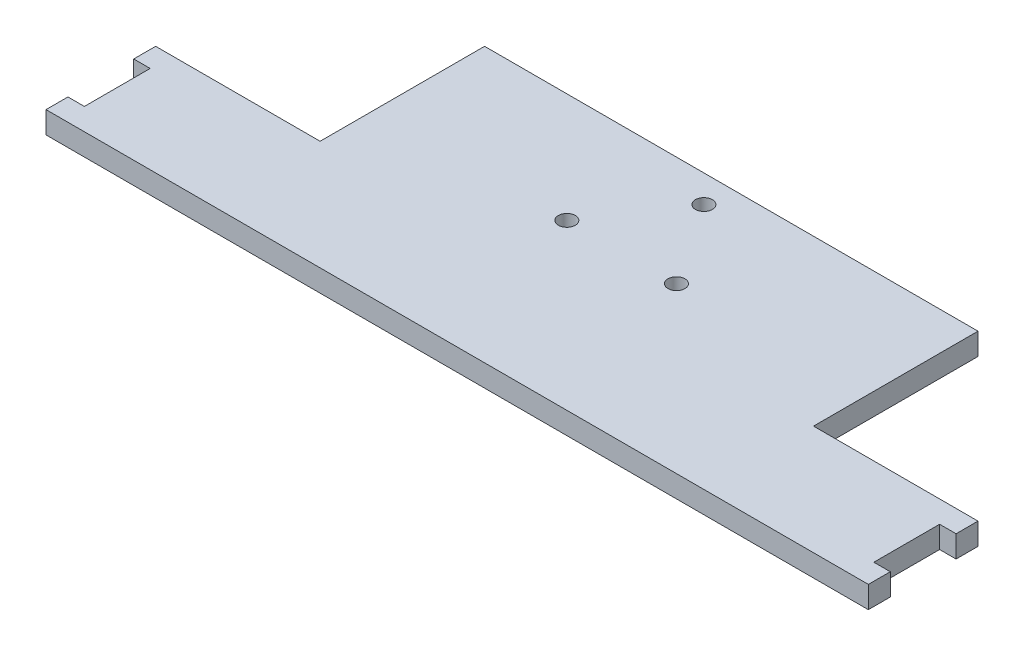
ISO-10303-21;
HEADER;
FILE_DESCRIPTION(('STEP AP214'),'2;1');
FILE_NAME('part.step','',(''),(''),'','','');
FILE_SCHEMA(('AUTOMOTIVE_DESIGN { 1 0 10303 214 1 1 1 1 }'));
ENDSEC;
DATA;
#1=APPLICATION_CONTEXT('core data for automotive mechanical design processes');
#2=APPLICATION_PROTOCOL_DEFINITION('international standard','automotive_design',2000,#1);
#3=PRODUCT_CONTEXT('',#1,'mechanical');
#4=PRODUCT('Part','Part','',(#3));
#5=PRODUCT_RELATED_PRODUCT_CATEGORY('part','',(#4));
#6=PRODUCT_DEFINITION_FORMATION('','',#4);
#7=PRODUCT_DEFINITION_CONTEXT('part definition',#1,'design');
#8=PRODUCT_DEFINITION('design','',#6,#7);
#9=PRODUCT_DEFINITION_SHAPE('','',#8);
#10=(LENGTH_UNIT() NAMED_UNIT(*) SI_UNIT(.MILLI.,.METRE.));
#11=(NAMED_UNIT(*) PLANE_ANGLE_UNIT() SI_UNIT($,.RADIAN.));
#12=(NAMED_UNIT(*) SI_UNIT($,.STERADIAN.) SOLID_ANGLE_UNIT());
#13=UNCERTAINTY_MEASURE_WITH_UNIT(LENGTH_MEASURE(1.E-05),#10,'distance_accuracy_value','');
#14=(GEOMETRIC_REPRESENTATION_CONTEXT(3) GLOBAL_UNCERTAINTY_ASSIGNED_CONTEXT((#13)) GLOBAL_UNIT_ASSIGNED_CONTEXT((#10,
#11,#12)) REPRESENTATION_CONTEXT('',''));
#15=CARTESIAN_POINT('',(0.,0.,0.));
#16=DIRECTION('',(0.,0.,1.));
#17=DIRECTION('',(1.,0.,0.));
#18=AXIS2_PLACEMENT_3D('',#15,#16,#17);
#19=CARTESIAN_POINT('',(0.,4.,0.));
#20=DIRECTION('',(0.,-1.,0.));
#21=DIRECTION('',(0.,0.,-1.));
#22=AXIS2_PLACEMENT_3D('',#19,#20,#21);
#23=PLANE('',#22);
#24=CARTESIAN_POINT('',(125.000000000001,4.,-245.));
#25=DIRECTION('',(0.,1.,0.));
#26=DIRECTION('',(0.,0.,1.));
#27=AXIS2_PLACEMENT_3D('',#24,#25,#26);
#28=CIRCLE('',#27,1.54999999999997);
#29=CARTESIAN_POINT('',(125.000000000001,4.,-243.45));
#30=VERTEX_POINT('',#29);
#31=EDGE_CURVE('E313',#30,#30,#28,.T.);
#32=ORIENTED_EDGE('',*,*,#31,.F.);
#33=EDGE_LOOP('',(#32));
#34=FACE_BOUND('',#33,.T.);
#35=CARTESIAN_POINT('',(115.000000000001,4.,-230.));
#36=DIRECTION('',(0.,1.,0.));
#37=DIRECTION('',(0.,0.,1.));
#38=AXIS2_PLACEMENT_3D('',#35,#36,#37);
#39=CIRCLE('',#38,1.54999999999999);
#40=CARTESIAN_POINT('',(115.000000000001,4.,-228.45));
#41=VERTEX_POINT('',#40);
#42=EDGE_CURVE('E309',#41,#41,#39,.T.);
#43=ORIENTED_EDGE('',*,*,#42,.F.);
#44=EDGE_LOOP('',(#43));
#45=FACE_BOUND('',#44,.T.);
#46=CARTESIAN_POINT('',(135.000000000001,4.,-230.));
#47=DIRECTION('',(0.,1.,0.));
#48=DIRECTION('',(0.,0.,1.));
#49=AXIS2_PLACEMENT_3D('',#46,#47,#48);
#50=CIRCLE('',#49,1.54999999999999);
#51=CARTESIAN_POINT('',(135.000000000001,4.,-228.45));
#52=VERTEX_POINT('',#51);
#53=EDGE_CURVE('E280',#52,#52,#50,.T.);
#54=ORIENTED_EDGE('',*,*,#53,.F.);
#55=EDGE_LOOP('',(#54));
#56=FACE_BOUND('',#55,.T.);
#57=DIRECTION('',(1.,0.,0.));
#58=VECTOR('',#57,1.);
#59=CARTESIAN_POINT('',(0.,4.,-204.000000000001));
#60=LINE('',#59,#58);
#61=CARTESIAN_POINT('',(50.0000000000004,4.,-204.000000000001));
#62=VERTEX_POINT('',#61);
#63=CARTESIAN_POINT('',(53.0000000000004,4.,-204.000000000001));
#64=VERTEX_POINT('',#63);
#65=EDGE_CURVE('E245',#62,#64,#60,.T.);
#66=ORIENTED_EDGE('',*,*,#65,.F.);
#67=DIRECTION('',(0.,0.,-1.));
#68=VECTOR('',#67,1.);
#69=CARTESIAN_POINT('',(49.9999999999998,4.,1.62493085091497E-13));
#70=LINE('',#69,#68);
#71=CARTESIAN_POINT('',(50.0000000000004,4.,-200.));
#72=VERTEX_POINT('',#71);
#73=EDGE_CURVE('E253',#72,#62,#70,.T.);
#74=ORIENTED_EDGE('',*,*,#73,.F.);
#75=DIRECTION('',(-1.,0.,0.));
#76=VECTOR('',#75,1.);
#77=CARTESIAN_POINT('',(200.,4.,-200.));
#78=LINE('',#77,#76);
#79=CARTESIAN_POINT('',(200.000000000001,4.,-200.));
#80=VERTEX_POINT('',#79);
#81=EDGE_CURVE('E328',#80,#72,#78,.T.);
#82=ORIENTED_EDGE('',*,*,#81,.F.);
#83=DIRECTION('',(0.,0.,-1.));
#84=VECTOR('',#83,1.);
#85=CARTESIAN_POINT('',(200.,4.,-45.9999999999993));
#86=LINE('',#85,#84);
#87=CARTESIAN_POINT('',(200.000000000001,4.,-204.));
#88=VERTEX_POINT('',#87);
#89=EDGE_CURVE('E133',#80,#88,#86,.T.);
#90=ORIENTED_EDGE('',*,*,#89,.T.);
#91=DIRECTION('',(-1.,0.,0.));
#92=VECTOR('',#91,1.);
#93=CARTESIAN_POINT('',(200.000000000001,4.,-204.));
#94=LINE('',#93,#92);
#95=CARTESIAN_POINT('',(197.000000000001,4.,-204.));
#96=VERTEX_POINT('',#95);
#97=EDGE_CURVE('E367',#88,#96,#94,.T.);
#98=ORIENTED_EDGE('',*,*,#97,.T.);
#99=DIRECTION('',(0.,0.,-1.));
#100=VECTOR('',#99,1.);
#101=CARTESIAN_POINT('',(197.000000000001,4.,-204.));
#102=LINE('',#101,#100);
#103=CARTESIAN_POINT('',(197.000000000001,4.,-216.));
#104=VERTEX_POINT('',#103);
#105=EDGE_CURVE('E370',#96,#104,#102,.T.);
#106=ORIENTED_EDGE('',*,*,#105,.T.);
#107=DIRECTION('',(-1.,0.,0.));
#108=VECTOR('',#107,1.);
#109=CARTESIAN_POINT('',(200.000000000001,4.,-216.));
#110=LINE('',#109,#108);
#111=CARTESIAN_POINT('',(200.000000000001,4.,-216.));
#112=VERTEX_POINT('',#111);
#113=EDGE_CURVE('E12',#112,#104,#110,.T.);
#114=ORIENTED_EDGE('',*,*,#113,.F.);
#115=DIRECTION('',(0.,0.,-1.));
#116=VECTOR('',#115,1.);
#117=CARTESIAN_POINT('',(200.000000000001,4.,-216.));
#118=LINE('',#117,#116);
#119=CARTESIAN_POINT('',(200.000000000001,4.,-219.999999999999));
#120=VERTEX_POINT('',#119);
#121=EDGE_CURVE('E357',#112,#120,#118,.T.);
#122=ORIENTED_EDGE('',*,*,#121,.T.);
#123=DIRECTION('',(-1.,0.,0.));
#124=VECTOR('',#123,1.);
#125=CARTESIAN_POINT('',(220.000000000001,4.,-219.999999999999));
#126=LINE('',#125,#124);
#127=CARTESIAN_POINT('',(170.000000000001,4.,-219.999999999999));
#128=VERTEX_POINT('',#127);
#129=EDGE_CURVE('E355',#120,#128,#126,.T.);
#130=ORIENTED_EDGE('',*,*,#129,.T.);
#131=DIRECTION('',(0.,0.,-1.));
#132=VECTOR('',#131,1.);
#133=CARTESIAN_POINT('',(170.000000000001,4.,-219.999999999999));
#134=LINE('',#133,#132);
#135=CARTESIAN_POINT('',(170.000000000001,4.,-250.));
#136=VERTEX_POINT('',#135);
#137=EDGE_CURVE('E338',#128,#136,#134,.T.);
#138=ORIENTED_EDGE('',*,*,#137,.T.);
#139=DIRECTION('',(-1.,0.,0.));
#140=VECTOR('',#139,1.);
#141=CARTESIAN_POINT('',(0.,4.,-250.));
#142=LINE('',#141,#140);
#143=CARTESIAN_POINT('',(80.0000000000007,4.,-250.));
#144=VERTEX_POINT('',#143);
#145=EDGE_CURVE('E335',#136,#144,#142,.T.);
#146=ORIENTED_EDGE('',*,*,#145,.T.);
#147=DIRECTION('',(0.,0.,1.));
#148=VECTOR('',#147,1.);
#149=CARTESIAN_POINT('',(80.0000000000007,4.,-250.));
#150=LINE('',#149,#148);
#151=CARTESIAN_POINT('',(80.0000000000005,4.,-220.));
#152=VERTEX_POINT('',#151);
#153=EDGE_CURVE('E277',#144,#152,#150,.T.);
#154=ORIENTED_EDGE('',*,*,#153,.T.);
#155=DIRECTION('',(1.,0.,0.));
#156=VECTOR('',#155,1.);
#157=CARTESIAN_POINT('',(5.55111512312578E-13,4.,-220.000000000001));
#158=LINE('',#157,#156);
#159=CARTESIAN_POINT('',(50.0000000000004,4.,-220.000000000001));
#160=VERTEX_POINT('',#159);
#161=EDGE_CURVE('E304',#160,#152,#158,.T.);
#162=ORIENTED_EDGE('',*,*,#161,.F.);
#163=DIRECTION('',(0.,0.,-1.));
#164=VECTOR('',#163,1.);
#165=CARTESIAN_POINT('',(50.0000000000043,4.,-8.67361737988514E-13));
#166=LINE('',#165,#164);
#167=CARTESIAN_POINT('',(50.0000000000005,4.,-216.000000000001));
#168=VERTEX_POINT('',#167);
#169=EDGE_CURVE('E271',#168,#160,#166,.T.);
#170=ORIENTED_EDGE('',*,*,#169,.F.);
#171=DIRECTION('',(1.,0.,0.));
#172=VECTOR('',#171,1.);
#173=CARTESIAN_POINT('',(0.,4.,-216.000000000001));
#174=LINE('',#173,#172);
#175=CARTESIAN_POINT('',(53.0000000000005,4.,-216.000000000001));
#176=VERTEX_POINT('',#175);
#177=EDGE_CURVE('E274',#168,#176,#174,.T.);
#178=ORIENTED_EDGE('',*,*,#177,.T.);
#179=DIRECTION('',(0.,0.,-1.));
#180=VECTOR('',#179,1.);
#181=CARTESIAN_POINT('',(52.9999999999993,4.,3.06467814089232E-13));
#182=LINE('',#181,#180);
#183=EDGE_CURVE('E263',#64,#176,#182,.T.);
#184=ORIENTED_EDGE('',*,*,#183,.F.);
#185=EDGE_LOOP('',(#66,#74,#82,#90,#98,#106,#114,#122,#130,#138,#146,#154,#162,#170,#178,#184));
#186=FACE_BOUND('',#185,.T.);
#187=ADVANCED_FACE('F129',(#34,#45,#56,#186),#23,.F.);
#188=CARTESIAN_POINT('',(0.,0.,0.));
#189=DIRECTION('',(0.,-1.,0.));
#190=DIRECTION('',(0.,0.,-1.));
#191=AXIS2_PLACEMENT_3D('',#188,#189,#190);
#192=PLANE('',#191);
#193=DIRECTION('',(0.,0.,1.));
#194=VECTOR('',#193,1.);
#195=CARTESIAN_POINT('',(49.9999999999998,0.,1.62493085091497E-13));
#196=LINE('',#195,#194);
#197=CARTESIAN_POINT('',(50.0000000000004,0.,-204.000000000001));
#198=VERTEX_POINT('',#197);
#199=CARTESIAN_POINT('',(50.0000000000004,0.,-200.));
#200=VERTEX_POINT('',#199);
#201=EDGE_CURVE('E278',#198,#200,#196,.T.);
#202=ORIENTED_EDGE('',*,*,#201,.F.);
#203=DIRECTION('',(-1.,0.,0.));
#204=VECTOR('',#203,1.);
#205=CARTESIAN_POINT('',(0.,0.,-204.000000000001));
#206=LINE('',#205,#204);
#207=CARTESIAN_POINT('',(53.0000000000004,0.,-204.000000000001));
#208=VERTEX_POINT('',#207);
#209=EDGE_CURVE('E248',#208,#198,#206,.T.);
#210=ORIENTED_EDGE('',*,*,#209,.F.);
#211=DIRECTION('',(0.,0.,1.));
#212=VECTOR('',#211,1.);
#213=CARTESIAN_POINT('',(52.9999999999993,0.,3.06467814089232E-13));
#214=LINE('',#213,#212);
#215=CARTESIAN_POINT('',(53.0000000000005,0.,-216.000000000001));
#216=VERTEX_POINT('',#215);
#217=EDGE_CURVE('E383',#216,#208,#214,.T.);
#218=ORIENTED_EDGE('',*,*,#217,.F.);
#219=DIRECTION('',(-1.,0.,0.));
#220=VECTOR('',#219,1.);
#221=CARTESIAN_POINT('',(0.,0.,-216.000000000001));
#222=LINE('',#221,#220);
#223=CARTESIAN_POINT('',(50.0000000000005,0.,-216.000000000001));
#224=VERTEX_POINT('',#223);
#225=EDGE_CURVE('E276',#216,#224,#222,.T.);
#226=ORIENTED_EDGE('',*,*,#225,.T.);
#227=DIRECTION('',(0.,0.,1.));
#228=VECTOR('',#227,1.);
#229=CARTESIAN_POINT('',(50.0000000000043,0.,-8.67361737988514E-13));
#230=LINE('',#229,#228);
#231=CARTESIAN_POINT('',(50.0000000000002,0.,-220.000000000001));
#232=VERTEX_POINT('',#231);
#233=EDGE_CURVE('E264',#232,#224,#230,.T.);
#234=ORIENTED_EDGE('',*,*,#233,.F.);
#235=DIRECTION('',(-1.,0.,0.));
#236=VECTOR('',#235,1.);
#237=CARTESIAN_POINT('',(1.5265566588596E-12,0.,-220.000000000001));
#238=LINE('',#237,#236);
#239=CARTESIAN_POINT('',(80.0000000000005,0.,-220.));
#240=VERTEX_POINT('',#239);
#241=EDGE_CURVE('E305',#240,#232,#238,.T.);
#242=ORIENTED_EDGE('',*,*,#241,.F.);
#243=DIRECTION('',(0.,0.,-1.));
#244=VECTOR('',#243,1.);
#245=CARTESIAN_POINT('',(79.9999999999989,0.,5.92118946466741E-13));
#246=LINE('',#245,#244);
#247=CARTESIAN_POINT('',(80.0000000000007,0.,-250.));
#248=VERTEX_POINT('',#247);
#249=EDGE_CURVE('E343',#240,#248,#246,.T.);
#250=ORIENTED_EDGE('',*,*,#249,.T.);
#251=DIRECTION('',(-1.,0.,0.));
#252=VECTOR('',#251,1.);
#253=CARTESIAN_POINT('',(0.,0.,-250.));
#254=LINE('',#253,#252);
#255=CARTESIAN_POINT('',(170.000000000001,0.,-250.));
#256=VERTEX_POINT('',#255);
#257=EDGE_CURVE('E332',#256,#248,#254,.T.);
#258=ORIENTED_EDGE('',*,*,#257,.F.);
#259=DIRECTION('',(0.,0.,1.));
#260=VECTOR('',#259,1.);
#261=CARTESIAN_POINT('',(169.999999999999,0.,1.73009754670752E-12));
#262=LINE('',#261,#260);
#263=CARTESIAN_POINT('',(170.000000000001,0.,-219.999999999999));
#264=VERTEX_POINT('',#263);
#265=EDGE_CURVE('E323',#256,#264,#262,.T.);
#266=ORIENTED_EDGE('',*,*,#265,.T.);
#267=DIRECTION('',(1.,0.,0.));
#268=VECTOR('',#267,1.);
#269=CARTESIAN_POINT('',(2.32036612146659E-12,0.,-220.000000000001));
#270=LINE('',#269,#268);
#271=CARTESIAN_POINT('',(200.000000000001,0.,-219.999999999999));
#272=VERTEX_POINT('',#271);
#273=EDGE_CURVE('E320',#264,#272,#270,.T.);
#274=ORIENTED_EDGE('',*,*,#273,.T.);
#275=DIRECTION('',(0.,0.,1.));
#276=VECTOR('',#275,1.);
#277=CARTESIAN_POINT('',(199.999999999995,0.,5.22457893941259E-12));
#278=LINE('',#277,#276);
#279=CARTESIAN_POINT('',(200.000000000001,0.,-216.));
#280=VERTEX_POINT('',#279);
#281=EDGE_CURVE('E148',#272,#280,#278,.T.);
#282=ORIENTED_EDGE('',*,*,#281,.T.);
#283=DIRECTION('',(1.,0.,0.));
#284=VECTOR('',#283,1.);
#285=CARTESIAN_POINT('',(0.,0.,-216.));
#286=LINE('',#285,#284);
#287=CARTESIAN_POINT('',(197.000000000001,0.,-216.));
#288=VERTEX_POINT('',#287);
#289=EDGE_CURVE('E298',#288,#280,#286,.T.);
#290=ORIENTED_EDGE('',*,*,#289,.F.);
#291=DIRECTION('',(0.,0.,1.));
#292=VECTOR('',#291,1.);
#293=CARTESIAN_POINT('',(197.,0.,4.55654033023242E-13));
#294=LINE('',#293,#292);
#295=CARTESIAN_POINT('',(197.000000000001,0.,-204.));
#296=VERTEX_POINT('',#295);
#297=EDGE_CURVE('E291',#288,#296,#294,.T.);
#298=ORIENTED_EDGE('',*,*,#297,.T.);
#299=DIRECTION('',(1.,0.,0.));
#300=VECTOR('',#299,1.);
#301=CARTESIAN_POINT('',(0.,0.,-204.));
#302=LINE('',#301,#300);
#303=CARTESIAN_POINT('',(200.000000000001,0.,-204.));
#304=VERTEX_POINT('',#303);
#305=EDGE_CURVE('E284',#296,#304,#302,.T.);
#306=ORIENTED_EDGE('',*,*,#305,.T.);
#307=DIRECTION('',(0.,0.,1.));
#308=VECTOR('',#307,1.);
#309=CARTESIAN_POINT('',(200.,0.,1.01887556057371E-12));
#310=LINE('',#309,#308);
#311=CARTESIAN_POINT('',(200.,0.,-200.));
#312=VERTEX_POINT('',#311);
#313=EDGE_CURVE('E281',#304,#312,#310,.T.);
#314=ORIENTED_EDGE('',*,*,#313,.T.);
#315=DIRECTION('',(1.,0.,0.));
#316=VECTOR('',#315,1.);
#317=CARTESIAN_POINT('',(0.,0.,-200.));
#318=LINE('',#317,#316);
#319=EDGE_CURVE('E329',#200,#312,#318,.T.);
#320=ORIENTED_EDGE('',*,*,#319,.F.);
#321=EDGE_LOOP('',(#202,#210,#218,#226,#234,#242,#250,#258,#266,#274,#282,#290,#298,#306,#314,#320));
#322=FACE_BOUND('',#321,.T.);
#323=CARTESIAN_POINT('',(125.000000000001,0.,-245.));
#324=DIRECTION('',(0.,-1.,0.));
#325=DIRECTION('',(0.,0.,-1.));
#326=AXIS2_PLACEMENT_3D('',#323,#324,#325);
#327=CIRCLE('',#326,1.54999999999997);
#328=CARTESIAN_POINT('',(125.000000000001,0.,-246.55));
#329=VERTEX_POINT('',#328);
#330=EDGE_CURVE('E314',#329,#329,#327,.T.);
#331=ORIENTED_EDGE('',*,*,#330,.F.);
#332=EDGE_LOOP('',(#331));
#333=FACE_BOUND('',#332,.T.);
#334=CARTESIAN_POINT('',(115.000000000001,0.,-230.));
#335=DIRECTION('',(0.,-1.,0.));
#336=DIRECTION('',(0.,0.,-1.));
#337=AXIS2_PLACEMENT_3D('',#334,#335,#336);
#338=CIRCLE('',#337,1.54999999999999);
#339=CARTESIAN_POINT('',(115.000000000001,0.,-231.55));
#340=VERTEX_POINT('',#339);
#341=EDGE_CURVE('E310',#340,#340,#338,.T.);
#342=ORIENTED_EDGE('',*,*,#341,.F.);
#343=EDGE_LOOP('',(#342));
#344=FACE_BOUND('',#343,.T.);
#345=CARTESIAN_POINT('',(135.000000000001,0.,-230.));
#346=DIRECTION('',(0.,-1.,0.));
#347=DIRECTION('',(0.,0.,-1.));
#348=AXIS2_PLACEMENT_3D('',#345,#346,#347);
#349=CIRCLE('',#348,1.54999999999999);
#350=CARTESIAN_POINT('',(135.000000000001,0.,-231.55));
#351=VERTEX_POINT('',#350);
#352=EDGE_CURVE('E306',#351,#351,#349,.T.);
#353=ORIENTED_EDGE('',*,*,#352,.F.);
#354=EDGE_LOOP('',(#353));
#355=FACE_BOUND('',#354,.T.);
#356=ADVANCED_FACE('F400',(#322,#333,#344,#355),#192,.T.);
#357=CARTESIAN_POINT('',(220.000000000001,-6.,-219.999999999999));
#358=DIRECTION('',(0.,0.,-1.));
#359=DIRECTION('',(-1.,0.,0.));
#360=AXIS2_PLACEMENT_3D('',#357,#358,#359);
#361=PLANE('',#360);
#362=ORIENTED_EDGE('',*,*,#129,.F.);
#363=DIRECTION('',(0.,-1.,0.));
#364=VECTOR('',#363,1.);
#365=CARTESIAN_POINT('',(200.000000000001,-6.,-219.999999999999));
#366=LINE('',#365,#364);
#367=EDGE_CURVE('E283',#120,#272,#366,.T.);
#368=ORIENTED_EDGE('',*,*,#367,.T.);
#369=ORIENTED_EDGE('',*,*,#273,.F.);
#370=DIRECTION('',(0.,1.,0.));
#371=VECTOR('',#370,1.);
#372=CARTESIAN_POINT('',(170.000000000001,-6.,-219.999999999999));
#373=LINE('',#372,#371);
#374=EDGE_CURVE('E289',#264,#128,#373,.T.);
#375=ORIENTED_EDGE('',*,*,#374,.T.);
#376=EDGE_LOOP('',(#362,#368,#369,#375));
#377=FACE_BOUND('',#376,.T.);
#378=ADVANCED_FACE('F419',(#377),#361,.T.);
#379=CARTESIAN_POINT('',(0.,4.,-250.));
#380=DIRECTION('',(0.,0.,1.));
#381=DIRECTION('',(1.,0.,0.));
#382=AXIS2_PLACEMENT_3D('',#379,#380,#381);
#383=PLANE('',#382);
#384=DIRECTION('',(0.,-1.,0.));
#385=VECTOR('',#384,1.);
#386=CARTESIAN_POINT('',(80.0000000000007,4.,-250.));
#387=LINE('',#386,#385);
#388=EDGE_CURVE('E319',#144,#248,#387,.T.);
#389=ORIENTED_EDGE('',*,*,#388,.F.);
#390=ORIENTED_EDGE('',*,*,#145,.F.);
#391=DIRECTION('',(0.,1.,0.));
#392=VECTOR('',#391,1.);
#393=CARTESIAN_POINT('',(170.000000000001,4.,-250.));
#394=LINE('',#393,#392);
#395=EDGE_CURVE('E326',#256,#136,#394,.T.);
#396=ORIENTED_EDGE('',*,*,#395,.F.);
#397=ORIENTED_EDGE('',*,*,#257,.T.);
#398=EDGE_LOOP('',(#389,#390,#396,#397));
#399=FACE_BOUND('',#398,.T.);
#400=ADVANCED_FACE('F412',(#399),#383,.F.);
#401=CARTESIAN_POINT('',(200.,-6.,-200.));
#402=DIRECTION('',(0.,0.,-1.));
#403=DIRECTION('',(-1.,0.,0.));
#404=AXIS2_PLACEMENT_3D('',#401,#402,#403);
#405=PLANE('',#404);
#406=ORIENTED_EDGE('',*,*,#319,.T.);
#407=DIRECTION('',(0.,1.,0.));
#408=VECTOR('',#407,1.);
#409=CARTESIAN_POINT('',(200.,-6.,-200.));
#410=LINE('',#409,#408);
#411=EDGE_CURVE('E331',#312,#80,#410,.T.);
#412=ORIENTED_EDGE('',*,*,#411,.T.);
#413=ORIENTED_EDGE('',*,*,#81,.T.);
#414=DIRECTION('',(0.,1.,0.));
#415=VECTOR('',#414,1.);
#416=CARTESIAN_POINT('',(49.9999999999999,-6.,-200.));
#417=LINE('',#416,#415);
#418=EDGE_CURVE('E256',#200,#72,#417,.T.);
#419=ORIENTED_EDGE('',*,*,#418,.F.);
#420=EDGE_LOOP('',(#406,#412,#413,#419));
#421=FACE_BOUND('',#420,.T.);
#422=ADVANCED_FACE('F438',(#421),#405,.F.);
#423=CARTESIAN_POINT('',(170.000000000001,-6.,-219.999999999999));
#424=DIRECTION('',(1.,0.,0.));
#425=DIRECTION('',(0.,0.,-1.));
#426=AXIS2_PLACEMENT_3D('',#423,#424,#425);
#427=PLANE('',#426);
#428=ORIENTED_EDGE('',*,*,#395,.T.);
#429=ORIENTED_EDGE('',*,*,#137,.F.);
#430=ORIENTED_EDGE('',*,*,#374,.F.);
#431=ORIENTED_EDGE('',*,*,#265,.F.);
#432=EDGE_LOOP('',(#428,#429,#430,#431));
#433=FACE_BOUND('',#432,.T.);
#434=ADVANCED_FACE('F416',(#433),#427,.T.);
#435=CARTESIAN_POINT('',(80.0000000000007,-6.,-250.));
#436=DIRECTION('',(-1.,0.,0.));
#437=DIRECTION('',(0.,0.,1.));
#438=AXIS2_PLACEMENT_3D('',#435,#436,#437);
#439=PLANE('',#438);
#440=DIRECTION('',(0.,1.,0.));
#441=VECTOR('',#440,1.);
#442=CARTESIAN_POINT('',(80.0000000000005,-6.,-220.));
#443=LINE('',#442,#441);
#444=EDGE_CURVE('E325',#240,#152,#443,.T.);
#445=ORIENTED_EDGE('',*,*,#444,.T.);
#446=ORIENTED_EDGE('',*,*,#153,.F.);
#447=ORIENTED_EDGE('',*,*,#388,.T.);
#448=ORIENTED_EDGE('',*,*,#249,.F.);
#449=EDGE_LOOP('',(#445,#446,#447,#448));
#450=FACE_BOUND('',#449,.T.);
#451=ADVANCED_FACE('F406',(#450),#439,.T.);
#452=CARTESIAN_POINT('',(5.55111512312578E-13,-6.,-220.000000000001));
#453=DIRECTION('',(0.,0.,1.));
#454=DIRECTION('',(1.,0.,0.));
#455=AXIS2_PLACEMENT_3D('',#452,#453,#454);
#456=PLANE('',#455);
#457=ORIENTED_EDGE('',*,*,#241,.T.);
#458=DIRECTION('',(0.,1.,0.));
#459=VECTOR('',#458,1.);
#460=CARTESIAN_POINT('',(50.0000000000004,-6.,-220.000000000001));
#461=LINE('',#460,#459);
#462=EDGE_CURVE('E301',#232,#160,#461,.T.);
#463=ORIENTED_EDGE('',*,*,#462,.T.);
#464=ORIENTED_EDGE('',*,*,#161,.T.);
#465=ORIENTED_EDGE('',*,*,#444,.F.);
#466=EDGE_LOOP('',(#457,#463,#464,#465));
#467=FACE_BOUND('',#466,.T.);
#468=ADVANCED_FACE('F404',(#467),#456,.F.);
#469=CARTESIAN_POINT('',(125.000000000001,-6.,-245.));
#470=DIRECTION('',(0.,1.,0.));
#471=DIRECTION('',(0.,0.,1.));
#472=AXIS2_PLACEMENT_3D('',#469,#470,#471);
#473=CYLINDRICAL_SURFACE('',#472,1.54999999999997);
#474=ORIENTED_EDGE('',*,*,#330,.T.);
#475=EDGE_LOOP('',(#474));
#476=FACE_BOUND('',#475,.T.);
#477=ORIENTED_EDGE('',*,*,#31,.T.);
#478=EDGE_LOOP('',(#477));
#479=FACE_BOUND('',#478,.T.);
#480=ADVANCED_FACE('F471',(#476,#479),#473,.F.);
#481=CARTESIAN_POINT('',(115.000000000001,-6.,-230.));
#482=DIRECTION('',(0.,1.,0.));
#483=DIRECTION('',(0.,0.,1.));
#484=AXIS2_PLACEMENT_3D('',#481,#482,#483);
#485=CYLINDRICAL_SURFACE('',#484,1.54999999999999);
#486=ORIENTED_EDGE('',*,*,#341,.T.);
#487=EDGE_LOOP('',(#486));
#488=FACE_BOUND('',#487,.T.);
#489=ORIENTED_EDGE('',*,*,#42,.T.);
#490=EDGE_LOOP('',(#489));
#491=FACE_BOUND('',#490,.T.);
#492=ADVANCED_FACE('F465',(#488,#491),#485,.F.);
#493=CARTESIAN_POINT('',(135.000000000001,-6.,-230.));
#494=DIRECTION('',(0.,1.,0.));
#495=DIRECTION('',(0.,0.,1.));
#496=AXIS2_PLACEMENT_3D('',#493,#494,#495);
#497=CYLINDRICAL_SURFACE('',#496,1.54999999999999);
#498=ORIENTED_EDGE('',*,*,#352,.T.);
#499=EDGE_LOOP('',(#498));
#500=FACE_BOUND('',#499,.T.);
#501=ORIENTED_EDGE('',*,*,#53,.T.);
#502=EDGE_LOOP('',(#501));
#503=FACE_BOUND('',#502,.T.);
#504=ADVANCED_FACE('F459',(#500,#503),#497,.F.);
#505=CARTESIAN_POINT('',(49.9999999999998,-6.,1.62493085091497E-13));
#506=DIRECTION('',(1.,0.,0.));
#507=DIRECTION('',(0.,0.,-1.));
#508=AXIS2_PLACEMENT_3D('',#505,#506,#507);
#509=PLANE('',#508);
#510=ORIENTED_EDGE('',*,*,#201,.T.);
#511=ORIENTED_EDGE('',*,*,#418,.T.);
#512=ORIENTED_EDGE('',*,*,#73,.T.);
#513=DIRECTION('',(0.,1.,0.));
#514=VECTOR('',#513,1.);
#515=CARTESIAN_POINT('',(50.0000000000004,-6.,-204.000000000001));
#516=LINE('',#515,#514);
#517=EDGE_CURVE('E240',#198,#62,#516,.T.);
#518=ORIENTED_EDGE('',*,*,#517,.F.);
#519=EDGE_LOOP('',(#510,#511,#512,#518));
#520=FACE_BOUND('',#519,.T.);
#521=ADVANCED_FACE('F254',(#520),#509,.F.);
#522=CARTESIAN_POINT('',(0.,-6.,-216.000000000001));
#523=DIRECTION('',(0.,0.,1.));
#524=DIRECTION('',(1.,0.,0.));
#525=AXIS2_PLACEMENT_3D('',#522,#523,#524);
#526=PLANE('',#525);
#527=DIRECTION('',(0.,1.,0.));
#528=VECTOR('',#527,1.);
#529=CARTESIAN_POINT('',(53.0000000000005,-6.,-216.000000000001));
#530=LINE('',#529,#528);
#531=EDGE_CURVE('E260',#216,#176,#530,.T.);
#532=ORIENTED_EDGE('',*,*,#531,.T.);
#533=ORIENTED_EDGE('',*,*,#177,.F.);
#534=DIRECTION('',(0.,1.,0.));
#535=VECTOR('',#534,1.);
#536=CARTESIAN_POINT('',(50.0000000000005,-6.,-216.000000000001));
#537=LINE('',#536,#535);
#538=EDGE_CURVE('E266',#224,#168,#537,.T.);
#539=ORIENTED_EDGE('',*,*,#538,.F.);
#540=ORIENTED_EDGE('',*,*,#225,.F.);
#541=EDGE_LOOP('',(#532,#533,#539,#540));
#542=FACE_BOUND('',#541,.T.);
#543=ADVANCED_FACE('F394',(#542),#526,.T.);
#544=CARTESIAN_POINT('',(52.9999999999993,-6.,3.06467814089232E-13));
#545=DIRECTION('',(1.,0.,0.));
#546=DIRECTION('',(0.,0.,-1.));
#547=AXIS2_PLACEMENT_3D('',#544,#545,#546);
#548=PLANE('',#547);
#549=ORIENTED_EDGE('',*,*,#217,.T.);
#550=DIRECTION('',(0.,1.,0.));
#551=VECTOR('',#550,1.);
#552=CARTESIAN_POINT('',(53.0000000000004,-6.,-204.000000000001));
#553=LINE('',#552,#551);
#554=EDGE_CURVE('E382',#208,#64,#553,.T.);
#555=ORIENTED_EDGE('',*,*,#554,.T.);
#556=ORIENTED_EDGE('',*,*,#183,.T.);
#557=ORIENTED_EDGE('',*,*,#531,.F.);
#558=EDGE_LOOP('',(#549,#555,#556,#557));
#559=FACE_BOUND('',#558,.T.);
#560=ADVANCED_FACE('F390',(#559),#548,.F.);
#561=CARTESIAN_POINT('',(0.,-6.,-204.000000000001));
#562=DIRECTION('',(0.,0.,1.));
#563=DIRECTION('',(1.,0.,0.));
#564=AXIS2_PLACEMENT_3D('',#561,#562,#563);
#565=PLANE('',#564);
#566=ORIENTED_EDGE('',*,*,#209,.T.);
#567=ORIENTED_EDGE('',*,*,#517,.T.);
#568=ORIENTED_EDGE('',*,*,#65,.T.);
#569=ORIENTED_EDGE('',*,*,#554,.F.);
#570=EDGE_LOOP('',(#566,#567,#568,#569));
#571=FACE_BOUND('',#570,.T.);
#572=ADVANCED_FACE('F242',(#571),#565,.F.);
#573=CARTESIAN_POINT('',(50.0000000000043,-6.,-8.67361737988514E-13));
#574=DIRECTION('',(1.,0.,0.));
#575=DIRECTION('',(0.,0.,-1.));
#576=AXIS2_PLACEMENT_3D('',#573,#574,#575);
#577=PLANE('',#576);
#578=ORIENTED_EDGE('',*,*,#233,.T.);
#579=ORIENTED_EDGE('',*,*,#538,.T.);
#580=ORIENTED_EDGE('',*,*,#169,.T.);
#581=ORIENTED_EDGE('',*,*,#462,.F.);
#582=EDGE_LOOP('',(#578,#579,#580,#581));
#583=FACE_BOUND('',#582,.T.);
#584=ADVANCED_FACE('F397',(#583),#577,.F.);
#585=CARTESIAN_POINT('',(200.,-6.,-45.9999999999993));
#586=DIRECTION('',(1.,0.,0.));
#587=DIRECTION('',(0.,0.,-1.));
#588=AXIS2_PLACEMENT_3D('',#585,#586,#587);
#589=PLANE('',#588);
#590=DIRECTION('',(0.,1.,0.));
#591=VECTOR('',#590,1.);
#592=CARTESIAN_POINT('',(200.000000000001,-6.,-204.));
#593=LINE('',#592,#591);
#594=EDGE_CURVE('E273',#304,#88,#593,.T.);
#595=ORIENTED_EDGE('',*,*,#594,.T.);
#596=ORIENTED_EDGE('',*,*,#89,.F.);
#597=ORIENTED_EDGE('',*,*,#411,.F.);
#598=ORIENTED_EDGE('',*,*,#313,.F.);
#599=EDGE_LOOP('',(#595,#596,#597,#598));
#600=FACE_BOUND('',#599,.T.);
#601=ADVANCED_FACE('F131',(#600),#589,.T.);
#602=CARTESIAN_POINT('',(200.000000000001,-6.,-204.));
#603=DIRECTION('',(0.,0.,-1.));
#604=DIRECTION('',(-1.,0.,0.));
#605=AXIS2_PLACEMENT_3D('',#602,#603,#604);
#606=PLANE('',#605);
#607=DIRECTION('',(0.,1.,0.));
#608=VECTOR('',#607,1.);
#609=CARTESIAN_POINT('',(197.000000000001,-6.,-204.));
#610=LINE('',#609,#608);
#611=EDGE_CURVE('E377',#296,#96,#610,.T.);
#612=ORIENTED_EDGE('',*,*,#611,.T.);
#613=ORIENTED_EDGE('',*,*,#97,.F.);
#614=ORIENTED_EDGE('',*,*,#594,.F.);
#615=ORIENTED_EDGE('',*,*,#305,.F.);
#616=EDGE_LOOP('',(#612,#613,#614,#615));
#617=FACE_BOUND('',#616,.T.);
#618=ADVANCED_FACE('F433',(#617),#606,.T.);
#619=CARTESIAN_POINT('',(197.000000000001,-6.,-204.));
#620=DIRECTION('',(1.,0.,0.));
#621=DIRECTION('',(0.,0.,-1.));
#622=AXIS2_PLACEMENT_3D('',#619,#620,#621);
#623=PLANE('',#622);
#624=DIRECTION('',(0.,1.,0.));
#625=VECTOR('',#624,1.);
#626=CARTESIAN_POINT('',(197.000000000001,-6.,-216.));
#627=LINE('',#626,#625);
#628=EDGE_CURVE('E299',#288,#104,#627,.T.);
#629=ORIENTED_EDGE('',*,*,#628,.T.);
#630=ORIENTED_EDGE('',*,*,#105,.F.);
#631=ORIENTED_EDGE('',*,*,#611,.F.);
#632=ORIENTED_EDGE('',*,*,#297,.F.);
#633=EDGE_LOOP('',(#629,#630,#631,#632));
#634=FACE_BOUND('',#633,.T.);
#635=ADVANCED_FACE('F430',(#634),#623,.T.);
#636=CARTESIAN_POINT('',(200.000000000001,-6.,-216.));
#637=DIRECTION('',(0.,0.,-1.));
#638=DIRECTION('',(-1.,0.,0.));
#639=AXIS2_PLACEMENT_3D('',#636,#637,#638);
#640=PLANE('',#639);
#641=ORIENTED_EDGE('',*,*,#289,.T.);
#642=DIRECTION('',(0.,1.,0.));
#643=VECTOR('',#642,1.);
#644=CARTESIAN_POINT('',(200.000000000001,-6.,-216.));
#645=LINE('',#644,#643);
#646=EDGE_CURVE('E139',#280,#112,#645,.T.);
#647=ORIENTED_EDGE('',*,*,#646,.T.);
#648=ORIENTED_EDGE('',*,*,#113,.T.);
#649=ORIENTED_EDGE('',*,*,#628,.F.);
#650=EDGE_LOOP('',(#641,#647,#648,#649));
#651=FACE_BOUND('',#650,.T.);
#652=ADVANCED_FACE('F426',(#651),#640,.F.);
#653=CARTESIAN_POINT('',(200.000000000001,-6.,-216.));
#654=DIRECTION('',(1.,0.,0.));
#655=DIRECTION('',(0.,0.,-1.));
#656=AXIS2_PLACEMENT_3D('',#653,#654,#655);
#657=PLANE('',#656);
#658=ORIENTED_EDGE('',*,*,#367,.F.);
#659=ORIENTED_EDGE('',*,*,#121,.F.);
#660=ORIENTED_EDGE('',*,*,#646,.F.);
#661=ORIENTED_EDGE('',*,*,#281,.F.);
#662=EDGE_LOOP('',(#658,#659,#660,#661));
#663=FACE_BOUND('',#662,.T.);
#664=ADVANCED_FACE('F421',(#663),#657,.T.);
#665=CLOSED_SHELL('',(#187,#356,#378,#400,#422,#434,#451,#468,#480,#492,#504,#521,#543,#560,
#572,#584,#601,#618,#635,#652,#664));
#666=MANIFOLD_SOLID_BREP('B2',#665);
#667=ADVANCED_BREP_SHAPE_REPRESENTATION('',(#18,#666),#14);
#668=SHAPE_DEFINITION_REPRESENTATION(#9,#667);
ENDSEC;
END-ISO-10303-21;
